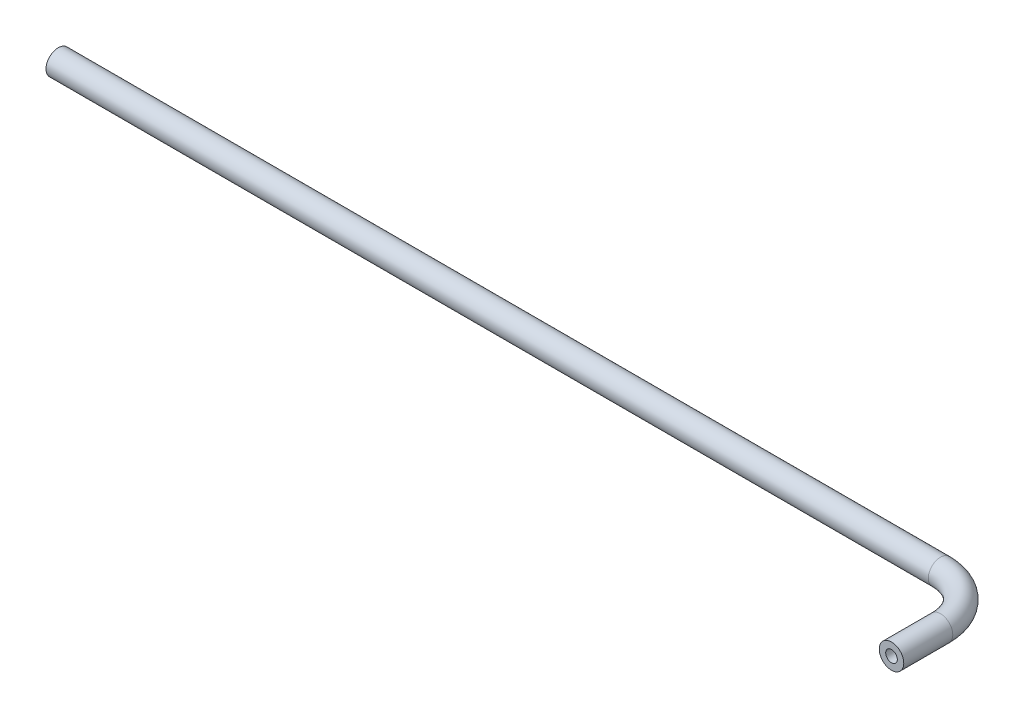
ISO-10303-21;
HEADER;
FILE_DESCRIPTION(('STEP AP214'),'2;1');
FILE_NAME('part.step','',(''),(''),'','','');
FILE_SCHEMA(('AUTOMOTIVE_DESIGN { 1 0 10303 214 1 1 1 1 }'));
ENDSEC;
DATA;
#1=APPLICATION_CONTEXT('core data for automotive mechanical design processes');
#2=APPLICATION_PROTOCOL_DEFINITION('international standard','automotive_design',2000,#1);
#3=PRODUCT_CONTEXT('',#1,'mechanical');
#4=PRODUCT('Part','Part','',(#3));
#5=PRODUCT_RELATED_PRODUCT_CATEGORY('part','',(#4));
#6=PRODUCT_DEFINITION_FORMATION('','',#4);
#7=PRODUCT_DEFINITION_CONTEXT('part definition',#1,'design');
#8=PRODUCT_DEFINITION('design','',#6,#7);
#9=PRODUCT_DEFINITION_SHAPE('','',#8);
#10=(LENGTH_UNIT() NAMED_UNIT(*) SI_UNIT(.MILLI.,.METRE.));
#11=(NAMED_UNIT(*) PLANE_ANGLE_UNIT() SI_UNIT($,.RADIAN.));
#12=(NAMED_UNIT(*) SI_UNIT($,.STERADIAN.) SOLID_ANGLE_UNIT());
#13=UNCERTAINTY_MEASURE_WITH_UNIT(LENGTH_MEASURE(1.E-05),#10,'distance_accuracy_value','');
#14=(GEOMETRIC_REPRESENTATION_CONTEXT(3) GLOBAL_UNCERTAINTY_ASSIGNED_CONTEXT((#13)) GLOBAL_UNIT_ASSIGNED_CONTEXT((#10,
#11,#12)) REPRESENTATION_CONTEXT('',''));
#15=CARTESIAN_POINT('',(0.,0.,0.));
#16=DIRECTION('',(0.,0.,1.));
#17=DIRECTION('',(1.,0.,0.));
#18=AXIS2_PLACEMENT_3D('',#15,#16,#17);
#19=CARTESIAN_POINT('',(-241.3,0.,0.));
#20=DIRECTION('',(1.,0.,0.));
#21=DIRECTION('',(0.,0.,-1.));
#22=AXIS2_PLACEMENT_3D('',#19,#20,#21);
#23=CYLINDRICAL_SURFACE('',#22,3.175);
#24=CARTESIAN_POINT('',(-12.7,0.,0.));
#25=DIRECTION('',(1.,0.,0.));
#26=DIRECTION('',(0.,0.,-1.));
#27=AXIS2_PLACEMENT_3D('',#24,#25,#26);
#28=CIRCLE('',#27,3.175);
#29=CARTESIAN_POINT('',(-12.7,0.,-3.17500000000003));
#30=VERTEX_POINT('',#29);
#31=EDGE_CURVE('E53',#30,#30,#28,.T.);
#32=ORIENTED_EDGE('',*,*,#31,.F.);
#33=EDGE_LOOP('',(#32));
#34=FACE_BOUND('',#33,.T.);
#35=CARTESIAN_POINT('',(-241.3,0.,0.));
#36=DIRECTION('',(1.,0.,0.));
#37=DIRECTION('',(0.,0.,-1.));
#38=AXIS2_PLACEMENT_3D('',#35,#36,#37);
#39=CIRCLE('',#38,3.175);
#40=CARTESIAN_POINT('',(-241.3,0.,-3.175));
#41=VERTEX_POINT('',#40);
#42=EDGE_CURVE('E51',#41,#41,#39,.T.);
#43=ORIENTED_EDGE('',*,*,#42,.T.);
#44=EDGE_LOOP('',(#43));
#45=FACE_BOUND('',#44,.T.);
#46=ADVANCED_FACE('F30',(#34,#45),#23,.T.);
#47=CARTESIAN_POINT('',(-12.7,0.,12.7));
#48=DIRECTION('',(0.,-1.,0.));
#49=DIRECTION('',(0.,0.,-1.));
#50=AXIS2_PLACEMENT_3D('',#47,#48,#49);
#51=TOROIDAL_SURFACE('',#50,12.7,3.175);
#52=CARTESIAN_POINT('',(0.,0.,12.7));
#53=DIRECTION('',(0.,0.,1.));
#54=DIRECTION('',(1.,0.,0.));
#55=AXIS2_PLACEMENT_3D('',#52,#53,#54);
#56=CIRCLE('',#55,3.175);
#57=CARTESIAN_POINT('',(3.17500000000004,0.,12.7));
#58=VERTEX_POINT('',#57);
#59=EDGE_CURVE('E34',#58,#58,#56,.T.);
#60=CARTESIAN_POINT('',(-12.7,0.,12.7));
#61=DIRECTION('',(0.,-1.,0.));
#62=DIRECTION('',(0.,0.,-1.));
#63=AXIS2_PLACEMENT_3D('',#60,#61,#62);
#64=CIRCLE('',#63,15.875);
#65=EDGE_CURVE('',#30,#58,#64,.T.);
#66=ORIENTED_EDGE('',*,*,#31,.T.);
#67=ORIENTED_EDGE('',*,*,#59,.F.);
#68=ORIENTED_EDGE('',*,*,#65,.T.);
#69=ORIENTED_EDGE('',*,*,#65,.F.);
#70=EDGE_LOOP('',(#66,#68,#67,#69));
#71=FACE_BOUND('',#70,.T.);
#72=ADVANCED_FACE('F61',(#71),#51,.T.);
#73=CARTESIAN_POINT('',(0.,0.,12.7));
#74=DIRECTION('',(0.,0.,1.));
#75=DIRECTION('',(1.,0.,0.));
#76=AXIS2_PLACEMENT_3D('',#73,#74,#75);
#77=CYLINDRICAL_SURFACE('',#76,3.175);
#78=CARTESIAN_POINT('',(0.,0.,25.4));
#79=DIRECTION('',(0.,0.,1.));
#80=DIRECTION('',(1.,0.,0.));
#81=AXIS2_PLACEMENT_3D('',#78,#79,#80);
#82=CIRCLE('',#81,3.175);
#83=CARTESIAN_POINT('',(3.175,0.,25.4));
#84=VERTEX_POINT('',#83);
#85=EDGE_CURVE('E47',#84,#84,#82,.T.);
#86=ORIENTED_EDGE('',*,*,#85,.F.);
#87=EDGE_LOOP('',(#86));
#88=FACE_BOUND('',#87,.T.);
#89=ORIENTED_EDGE('',*,*,#59,.T.);
#90=EDGE_LOOP('',(#89));
#91=FACE_BOUND('',#90,.T.);
#92=ADVANCED_FACE('F32',(#88,#91),#77,.T.);
#93=CARTESIAN_POINT('',(-241.3,0.,0.));
#94=DIRECTION('',(1.,0.,0.));
#95=DIRECTION('',(0.,0.,-1.));
#96=AXIS2_PLACEMENT_3D('',#93,#94,#95);
#97=PLANE('',#96);
#98=CARTESIAN_POINT('',(-241.3,0.,0.));
#99=DIRECTION('',(1.,0.,0.));
#100=DIRECTION('',(0.,0.,-1.));
#101=AXIS2_PLACEMENT_3D('',#98,#99,#100);
#102=CIRCLE('',#101,1.5);
#103=CARTESIAN_POINT('',(-241.3,0.,-1.5));
#104=VERTEX_POINT('',#103);
#105=EDGE_CURVE('E50',#104,#104,#102,.F.);
#106=ORIENTED_EDGE('',*,*,#105,.F.);
#107=EDGE_LOOP('',(#106));
#108=FACE_BOUND('',#107,.T.);
#109=ORIENTED_EDGE('',*,*,#42,.F.);
#110=EDGE_LOOP('',(#109));
#111=FACE_BOUND('',#110,.T.);
#112=ADVANCED_FACE('F67',(#108,#111),#97,.F.);
#113=CARTESIAN_POINT('',(0.,0.,25.4));
#114=DIRECTION('',(0.,0.,1.));
#115=DIRECTION('',(1.,0.,0.));
#116=AXIS2_PLACEMENT_3D('',#113,#114,#115);
#117=PLANE('',#116);
#118=CARTESIAN_POINT('',(0.,0.,25.4));
#119=DIRECTION('',(0.,0.,1.));
#120=DIRECTION('',(1.,0.,0.));
#121=AXIS2_PLACEMENT_3D('',#118,#119,#120);
#122=CIRCLE('',#121,1.5);
#123=CARTESIAN_POINT('',(1.5,0.,25.4));
#124=VERTEX_POINT('',#123);
#125=EDGE_CURVE('E10',#124,#124,#122,.F.);
#126=ORIENTED_EDGE('',*,*,#125,.T.);
#127=EDGE_LOOP('',(#126));
#128=FACE_BOUND('',#127,.T.);
#129=ORIENTED_EDGE('',*,*,#85,.T.);
#130=EDGE_LOOP('',(#129));
#131=FACE_BOUND('',#130,.T.);
#132=ADVANCED_FACE('F85',(#128,#131),#117,.T.);
#133=CARTESIAN_POINT('',(-241.3,0.,0.));
#134=DIRECTION('',(1.,0.,0.));
#135=DIRECTION('',(0.,0.,-1.));
#136=AXIS2_PLACEMENT_3D('',#133,#134,#135);
#137=CYLINDRICAL_SURFACE('',#136,1.5);
#138=CARTESIAN_POINT('',(-12.7,0.,0.));
#139=DIRECTION('',(1.,0.,0.));
#140=DIRECTION('',(0.,0.,-1.));
#141=AXIS2_PLACEMENT_3D('',#138,#139,#140);
#142=CIRCLE('',#141,1.5);
#143=CARTESIAN_POINT('',(-12.7,0.,-1.50000000000003));
#144=VERTEX_POINT('',#143);
#145=EDGE_CURVE('E43',#144,#144,#142,.F.);
#146=ORIENTED_EDGE('',*,*,#145,.F.);
#147=EDGE_LOOP('',(#146));
#148=FACE_BOUND('',#147,.T.);
#149=ORIENTED_EDGE('',*,*,#105,.T.);
#150=EDGE_LOOP('',(#149));
#151=FACE_BOUND('',#150,.T.);
#152=ADVANCED_FACE('F79',(#148,#151),#137,.F.);
#153=CARTESIAN_POINT('',(-12.7,0.,12.7));
#154=DIRECTION('',(0.,-1.,0.));
#155=DIRECTION('',(0.,0.,-1.));
#156=AXIS2_PLACEMENT_3D('',#153,#154,#155);
#157=TOROIDAL_SURFACE('',#156,12.7,1.5);
#158=CARTESIAN_POINT('',(0.,0.,12.7));
#159=DIRECTION('',(0.,0.,1.));
#160=DIRECTION('',(1.,0.,0.));
#161=AXIS2_PLACEMENT_3D('',#158,#159,#160);
#162=CIRCLE('',#161,1.5);
#163=CARTESIAN_POINT('',(1.50000000000004,0.,12.7));
#164=VERTEX_POINT('',#163);
#165=EDGE_CURVE('E38',#164,#164,#162,.F.);
#166=CARTESIAN_POINT('',(-12.7,0.,12.7));
#167=DIRECTION('',(0.,-1.,0.));
#168=DIRECTION('',(0.,0.,-1.));
#169=AXIS2_PLACEMENT_3D('',#166,#167,#168);
#170=CIRCLE('',#169,14.2);
#171=EDGE_CURVE('',#144,#164,#170,.T.);
#172=ORIENTED_EDGE('',*,*,#145,.T.);
#173=ORIENTED_EDGE('',*,*,#165,.F.);
#174=ORIENTED_EDGE('',*,*,#171,.T.);
#175=ORIENTED_EDGE('',*,*,#171,.F.);
#176=EDGE_LOOP('',(#172,#174,#173,#175));
#177=FACE_BOUND('',#176,.T.);
#178=ADVANCED_FACE('F73',(#177),#157,.F.);
#179=CARTESIAN_POINT('',(0.,0.,12.7));
#180=DIRECTION('',(0.,0.,1.));
#181=DIRECTION('',(1.,0.,0.));
#182=AXIS2_PLACEMENT_3D('',#179,#180,#181);
#183=CYLINDRICAL_SURFACE('',#182,1.5);
#184=ORIENTED_EDGE('',*,*,#125,.F.);
#185=EDGE_LOOP('',(#184));
#186=FACE_BOUND('',#185,.T.);
#187=ORIENTED_EDGE('',*,*,#165,.T.);
#188=EDGE_LOOP('',(#187));
#189=FACE_BOUND('',#188,.T.);
#190=ADVANCED_FACE('F71',(#186,#189),#183,.F.);
#191=CLOSED_SHELL('',(#46,#72,#92,#112,#132,#152,#178,#190));
#192=MANIFOLD_SOLID_BREP('B2',#191);
#193=ADVANCED_BREP_SHAPE_REPRESENTATION('',(#18,#192),#14);
#194=SHAPE_DEFINITION_REPRESENTATION(#9,#193);
ENDSEC;
END-ISO-10303-21;
